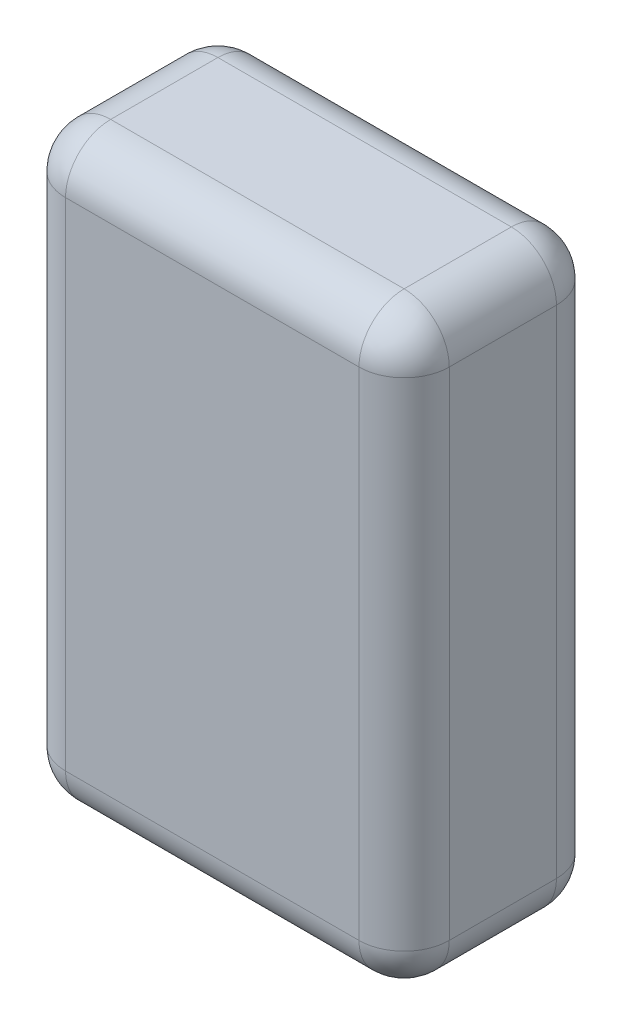
ISO-10303-21;
HEADER;
FILE_DESCRIPTION(('STEP AP214'),'2;1');
FILE_NAME('part.step','',(''),(''),'','','');
FILE_SCHEMA(('AUTOMOTIVE_DESIGN { 1 0 10303 214 1 1 1 1 }'));
ENDSEC;
DATA;
#1=APPLICATION_CONTEXT('core data for automotive mechanical design processes');
#2=APPLICATION_PROTOCOL_DEFINITION('international standard','automotive_design',2000,#1);
#3=PRODUCT_CONTEXT('',#1,'mechanical');
#4=PRODUCT('Part','Part','',(#3));
#5=PRODUCT_RELATED_PRODUCT_CATEGORY('part','',(#4));
#6=PRODUCT_DEFINITION_FORMATION('','',#4);
#7=PRODUCT_DEFINITION_CONTEXT('part definition',#1,'design');
#8=PRODUCT_DEFINITION('design','',#6,#7);
#9=PRODUCT_DEFINITION_SHAPE('','',#8);
#10=(LENGTH_UNIT() NAMED_UNIT(*) SI_UNIT(.MILLI.,.METRE.));
#11=(NAMED_UNIT(*) PLANE_ANGLE_UNIT() SI_UNIT($,.RADIAN.));
#12=(NAMED_UNIT(*) SI_UNIT($,.STERADIAN.) SOLID_ANGLE_UNIT());
#13=UNCERTAINTY_MEASURE_WITH_UNIT(LENGTH_MEASURE(1.E-05),#10,'distance_accuracy_value','');
#14=(GEOMETRIC_REPRESENTATION_CONTEXT(3) GLOBAL_UNCERTAINTY_ASSIGNED_CONTEXT((#13)) GLOBAL_UNIT_ASSIGNED_CONTEXT((#10,
#11,#12)) REPRESENTATION_CONTEXT('',''));
#15=CARTESIAN_POINT('',(0.,0.,0.));
#16=DIRECTION('',(0.,0.,1.));
#17=DIRECTION('',(1.,0.,0.));
#18=AXIS2_PLACEMENT_3D('',#15,#16,#17);
#19=CARTESIAN_POINT('',(8.5,-13.,8.75));
#20=DIRECTION('',(-1.,0.,0.));
#21=DIRECTION('',(0.,0.,1.));
#22=AXIS2_PLACEMENT_3D('',#19,#20,#21);
#23=PLANE('',#22);
#24=DIRECTION('',(0.,1.,0.));
#25=VECTOR('',#24,1.);
#26=CARTESIAN_POINT('',(8.5,-13.,6.75));
#27=LINE('',#26,#25);
#28=CARTESIAN_POINT('',(8.5,11.,6.75));
#29=VERTEX_POINT('',#28);
#30=CARTESIAN_POINT('',(8.5,-11.,6.75));
#31=VERTEX_POINT('',#30);
#32=EDGE_CURVE('E41',#29,#31,#27,.F.);
#33=ORIENTED_EDGE('',*,*,#32,.T.);
#34=DIRECTION('',(0.,0.,-1.));
#35=VECTOR('',#34,1.);
#36=CARTESIAN_POINT('',(8.5,-11.,8.75));
#37=LINE('',#36,#35);
#38=CARTESIAN_POINT('',(8.5,-11.,2.));
#39=VERTEX_POINT('',#38);
#40=EDGE_CURVE('E11',#31,#39,#37,.T.);
#41=ORIENTED_EDGE('',*,*,#40,.T.);
#42=DIRECTION('',(0.,1.,0.));
#43=VECTOR('',#42,1.);
#44=CARTESIAN_POINT('',(8.5,13.,2.));
#45=LINE('',#44,#43);
#46=CARTESIAN_POINT('',(8.5,11.,2.));
#47=VERTEX_POINT('',#46);
#48=EDGE_CURVE('E193',#39,#47,#45,.T.);
#49=ORIENTED_EDGE('',*,*,#48,.T.);
#50=DIRECTION('',(0.,0.,-1.));
#51=VECTOR('',#50,1.);
#52=CARTESIAN_POINT('',(8.5,11.,8.75));
#53=LINE('',#52,#51);
#54=EDGE_CURVE('E52',#47,#29,#53,.F.);
#55=ORIENTED_EDGE('',*,*,#54,.T.);
#56=EDGE_LOOP('',(#33,#41,#49,#55));
#57=FACE_BOUND('',#56,.T.);
#58=ADVANCED_FACE('F32',(#57),#23,.F.);
#59=CARTESIAN_POINT('',(-8.5,13.,8.75));
#60=DIRECTION('',(0.,-1.,0.));
#61=DIRECTION('',(0.,0.,-1.));
#62=AXIS2_PLACEMENT_3D('',#59,#60,#61);
#63=PLANE('',#62);
#64=DIRECTION('',(-1.,0.,0.));
#65=VECTOR('',#64,1.);
#66=CARTESIAN_POINT('',(-8.5,13.,2.));
#67=LINE('',#66,#65);
#68=CARTESIAN_POINT('',(6.5,13.,2.));
#69=VERTEX_POINT('',#68);
#70=CARTESIAN_POINT('',(-6.5,13.,2.));
#71=VERTEX_POINT('',#70);
#72=EDGE_CURVE('E161',#69,#71,#67,.T.);
#73=ORIENTED_EDGE('',*,*,#72,.T.);
#74=DIRECTION('',(0.,0.,-1.));
#75=VECTOR('',#74,1.);
#76=CARTESIAN_POINT('',(-6.5,13.,8.75));
#77=LINE('',#76,#75);
#78=CARTESIAN_POINT('',(-6.5,13.,6.75));
#79=VERTEX_POINT('',#78);
#80=EDGE_CURVE('E127',#71,#79,#77,.F.);
#81=ORIENTED_EDGE('',*,*,#80,.T.);
#82=DIRECTION('',(-1.,0.,0.));
#83=VECTOR('',#82,1.);
#84=CARTESIAN_POINT('',(-8.5,13.,6.75));
#85=LINE('',#84,#83);
#86=CARTESIAN_POINT('',(6.5,13.,6.75));
#87=VERTEX_POINT('',#86);
#88=EDGE_CURVE('E163',#79,#87,#85,.F.);
#89=ORIENTED_EDGE('',*,*,#88,.T.);
#90=DIRECTION('',(0.,0.,-1.));
#91=VECTOR('',#90,1.);
#92=CARTESIAN_POINT('',(6.5,13.,8.75));
#93=LINE('',#92,#91);
#94=EDGE_CURVE('E156',#87,#69,#93,.T.);
#95=ORIENTED_EDGE('',*,*,#94,.T.);
#96=EDGE_LOOP('',(#73,#81,#89,#95));
#97=FACE_BOUND('',#96,.T.);
#98=ADVANCED_FACE('F290',(#97),#63,.F.);
#99=CARTESIAN_POINT('',(-8.5,-13.,8.75));
#100=DIRECTION('',(1.,0.,0.));
#101=DIRECTION('',(0.,0.,-1.));
#102=AXIS2_PLACEMENT_3D('',#99,#100,#101);
#103=PLANE('',#102);
#104=DIRECTION('',(0.,0.,-1.));
#105=VECTOR('',#104,1.);
#106=CARTESIAN_POINT('',(-8.5,-11.,8.75));
#107=LINE('',#106,#105);
#108=CARTESIAN_POINT('',(-8.5,-11.,2.));
#109=VERTEX_POINT('',#108);
#110=CARTESIAN_POINT('',(-8.5,-11.,6.75));
#111=VERTEX_POINT('',#110);
#112=EDGE_CURVE('E149',#109,#111,#107,.F.);
#113=ORIENTED_EDGE('',*,*,#112,.T.);
#114=DIRECTION('',(0.,-1.,0.));
#115=VECTOR('',#114,1.);
#116=CARTESIAN_POINT('',(-8.5,-13.,6.75));
#117=LINE('',#116,#115);
#118=CARTESIAN_POINT('',(-8.5,11.,6.75));
#119=VERTEX_POINT('',#118);
#120=EDGE_CURVE('E153',#111,#119,#117,.F.);
#121=ORIENTED_EDGE('',*,*,#120,.T.);
#122=DIRECTION('',(0.,0.,-1.));
#123=VECTOR('',#122,1.);
#124=CARTESIAN_POINT('',(-8.5,11.,8.75));
#125=LINE('',#124,#123);
#126=CARTESIAN_POINT('',(-8.5,11.,2.));
#127=VERTEX_POINT('',#126);
#128=EDGE_CURVE('E125',#119,#127,#125,.T.);
#129=ORIENTED_EDGE('',*,*,#128,.T.);
#130=DIRECTION('',(0.,-1.,0.));
#131=VECTOR('',#130,1.);
#132=CARTESIAN_POINT('',(-8.5,-13.,2.));
#133=LINE('',#132,#131);
#134=EDGE_CURVE('E143',#127,#109,#133,.T.);
#135=ORIENTED_EDGE('',*,*,#134,.T.);
#136=EDGE_LOOP('',(#113,#121,#129,#135));
#137=FACE_BOUND('',#136,.T.);
#138=ADVANCED_FACE('F151',(#137),#103,.F.);
#139=CARTESIAN_POINT('',(-8.5,-13.,8.75));
#140=DIRECTION('',(0.,1.,0.));
#141=DIRECTION('',(0.,0.,1.));
#142=AXIS2_PLACEMENT_3D('',#139,#140,#141);
#143=PLANE('',#142);
#144=DIRECTION('',(1.,0.,0.));
#145=VECTOR('',#144,1.);
#146=CARTESIAN_POINT('',(-8.5,-13.,6.75));
#147=LINE('',#146,#145);
#148=CARTESIAN_POINT('',(6.5,-13.,6.75));
#149=VERTEX_POINT('',#148);
#150=CARTESIAN_POINT('',(-6.5,-13.,6.75));
#151=VERTEX_POINT('',#150);
#152=EDGE_CURVE('E170',#149,#151,#147,.F.);
#153=ORIENTED_EDGE('',*,*,#152,.T.);
#154=DIRECTION('',(0.,0.,-1.));
#155=VECTOR('',#154,1.);
#156=CARTESIAN_POINT('',(-6.5,-13.,8.75));
#157=LINE('',#156,#155);
#158=CARTESIAN_POINT('',(-6.5,-13.,2.));
#159=VERTEX_POINT('',#158);
#160=EDGE_CURVE('E172',#151,#159,#157,.T.);
#161=ORIENTED_EDGE('',*,*,#160,.T.);
#162=DIRECTION('',(1.,0.,0.));
#163=VECTOR('',#162,1.);
#164=CARTESIAN_POINT('',(8.5,-13.,2.));
#165=LINE('',#164,#163);
#166=CARTESIAN_POINT('',(6.5,-13.,2.));
#167=VERTEX_POINT('',#166);
#168=EDGE_CURVE('E168',#159,#167,#165,.T.);
#169=ORIENTED_EDGE('',*,*,#168,.T.);
#170=DIRECTION('',(0.,0.,-1.));
#171=VECTOR('',#170,1.);
#172=CARTESIAN_POINT('',(6.5,-13.,8.75));
#173=LINE('',#172,#171);
#174=EDGE_CURVE('E166',#167,#149,#173,.F.);
#175=ORIENTED_EDGE('',*,*,#174,.T.);
#176=EDGE_LOOP('',(#153,#161,#169,#175));
#177=FACE_BOUND('',#176,.T.);
#178=ADVANCED_FACE('F312',(#177),#143,.F.);
#179=CARTESIAN_POINT('',(0.,0.,8.75));
#180=DIRECTION('',(0.,0.,-1.));
#181=DIRECTION('',(-1.,0.,0.));
#182=AXIS2_PLACEMENT_3D('',#179,#180,#181);
#183=PLANE('',#182);
#184=DIRECTION('',(0.,-1.,0.));
#185=VECTOR('',#184,1.);
#186=CARTESIAN_POINT('',(-6.5,0.,8.75));
#187=LINE('',#186,#185);
#188=CARTESIAN_POINT('',(-6.5,11.,8.75));
#189=VERTEX_POINT('',#188);
#190=CARTESIAN_POINT('',(-6.5,-11.,8.75));
#191=VERTEX_POINT('',#190);
#192=EDGE_CURVE('E179',#189,#191,#187,.T.);
#193=ORIENTED_EDGE('',*,*,#192,.T.);
#194=DIRECTION('',(1.,0.,0.));
#195=VECTOR('',#194,1.);
#196=CARTESIAN_POINT('',(0.,-11.,8.75));
#197=LINE('',#196,#195);
#198=CARTESIAN_POINT('',(6.5,-11.,8.75));
#199=VERTEX_POINT('',#198);
#200=EDGE_CURVE('E181',#191,#199,#197,.T.);
#201=ORIENTED_EDGE('',*,*,#200,.T.);
#202=DIRECTION('',(0.,1.,0.));
#203=VECTOR('',#202,1.);
#204=CARTESIAN_POINT('',(6.5,0.,8.75));
#205=LINE('',#204,#203);
#206=CARTESIAN_POINT('',(6.5,11.,8.75));
#207=VERTEX_POINT('',#206);
#208=EDGE_CURVE('E175',#199,#207,#205,.T.);
#209=ORIENTED_EDGE('',*,*,#208,.T.);
#210=DIRECTION('',(-1.,0.,0.));
#211=VECTOR('',#210,1.);
#212=CARTESIAN_POINT('',(0.,11.,8.75));
#213=LINE('',#212,#211);
#214=EDGE_CURVE('E177',#207,#189,#213,.T.);
#215=ORIENTED_EDGE('',*,*,#214,.T.);
#216=EDGE_LOOP('',(#193,#201,#209,#215));
#217=FACE_BOUND('',#216,.T.);
#218=ADVANCED_FACE('F268',(#217),#183,.F.);
#219=CARTESIAN_POINT('',(0.,0.,0.));
#220=DIRECTION('',(0.,0.,-1.));
#221=DIRECTION('',(-1.,0.,0.));
#222=AXIS2_PLACEMENT_3D('',#219,#220,#221);
#223=PLANE('',#222);
#224=DIRECTION('',(0.,-1.,0.));
#225=VECTOR('',#224,1.);
#226=CARTESIAN_POINT('',(-6.5,13.,0.));
#227=LINE('',#226,#225);
#228=CARTESIAN_POINT('',(-6.5,-11.,0.));
#229=VERTEX_POINT('',#228);
#230=CARTESIAN_POINT('',(-6.5,11.,0.));
#231=VERTEX_POINT('',#230);
#232=EDGE_CURVE('E188',#229,#231,#227,.F.);
#233=ORIENTED_EDGE('',*,*,#232,.T.);
#234=DIRECTION('',(-1.,0.,0.));
#235=VECTOR('',#234,1.);
#236=CARTESIAN_POINT('',(8.5,11.,0.));
#237=LINE('',#236,#235);
#238=CARTESIAN_POINT('',(6.5,11.,0.));
#239=VERTEX_POINT('',#238);
#240=EDGE_CURVE('E190',#231,#239,#237,.F.);
#241=ORIENTED_EDGE('',*,*,#240,.T.);
#242=DIRECTION('',(0.,1.,0.));
#243=VECTOR('',#242,1.);
#244=CARTESIAN_POINT('',(6.5,-13.,0.));
#245=LINE('',#244,#243);
#246=CARTESIAN_POINT('',(6.5,-11.,0.));
#247=VERTEX_POINT('',#246);
#248=EDGE_CURVE('E184',#239,#247,#245,.F.);
#249=ORIENTED_EDGE('',*,*,#248,.T.);
#250=DIRECTION('',(1.,0.,0.));
#251=VECTOR('',#250,1.);
#252=CARTESIAN_POINT('',(-8.5,-11.,0.));
#253=LINE('',#252,#251);
#254=EDGE_CURVE('E186',#247,#229,#253,.F.);
#255=ORIENTED_EDGE('',*,*,#254,.T.);
#256=EDGE_LOOP('',(#233,#241,#249,#255));
#257=FACE_BOUND('',#256,.T.);
#258=ADVANCED_FACE('F298',(#257),#223,.T.);
#259=CARTESIAN_POINT('',(6.5,-11.,8.75));
#260=DIRECTION('',(0.,0.,-1.));
#261=DIRECTION('',(-1.,0.,0.));
#262=AXIS2_PLACEMENT_3D('',#259,#260,#261);
#263=CYLINDRICAL_SURFACE('',#262,2.);
#264=CARTESIAN_POINT('',(6.5,-11.,6.75));
#265=DIRECTION('',(0.,0.,1.));
#266=DIRECTION('',(1.,0.,0.));
#267=AXIS2_PLACEMENT_3D('',#264,#265,#266);
#268=CIRCLE('',#267,2.);
#269=EDGE_CURVE('E36',#149,#31,#268,.T.);
#270=ORIENTED_EDGE('',*,*,#269,.F.);
#271=ORIENTED_EDGE('',*,*,#174,.F.);
#272=CARTESIAN_POINT('',(6.5,-11.,2.));
#273=DIRECTION('',(0.,0.,-1.));
#274=DIRECTION('',(-1.,0.,0.));
#275=AXIS2_PLACEMENT_3D('',#272,#273,#274);
#276=CIRCLE('',#275,2.);
#277=EDGE_CURVE('E247',#39,#167,#276,.T.);
#278=ORIENTED_EDGE('',*,*,#277,.F.);
#279=ORIENTED_EDGE('',*,*,#40,.F.);
#280=EDGE_LOOP('',(#270,#271,#278,#279));
#281=FACE_BOUND('',#280,.T.);
#282=ADVANCED_FACE('F34',(#281),#263,.T.);
#283=CARTESIAN_POINT('',(6.5,-11.,6.75));
#284=DIRECTION('',(0.,0.,1.));
#285=DIRECTION('',(1.,0.,0.));
#286=AXIS2_PLACEMENT_3D('',#283,#284,#285);
#287=SPHERICAL_SURFACE('',#286,2.);
#288=CARTESIAN_POINT('',(6.5,-11.,6.75));
#289=DIRECTION('',(1.,0.,0.));
#290=DIRECTION('',(0.,0.,-1.));
#291=AXIS2_PLACEMENT_3D('',#288,#289,#290);
#292=CIRCLE('',#291,2.);
#293=EDGE_CURVE('E242',#149,#199,#292,.F.);
#294=ORIENTED_EDGE('',*,*,#293,.F.);
#295=ORIENTED_EDGE('',*,*,#269,.T.);
#296=CARTESIAN_POINT('',(6.5,-11.,6.75));
#297=DIRECTION('',(0.,-1.,0.));
#298=DIRECTION('',(0.,0.,-1.));
#299=AXIS2_PLACEMENT_3D('',#296,#297,#298);
#300=CIRCLE('',#299,2.);
#301=EDGE_CURVE('E245',#199,#31,#300,.F.);
#302=ORIENTED_EDGE('',*,*,#301,.F.);
#303=EDGE_LOOP('',(#294,#295,#302));
#304=FACE_BOUND('',#303,.T.);
#305=ADVANCED_FACE('F258',(#304),#287,.T.);
#306=CARTESIAN_POINT('',(6.5,-11.,2.));
#307=DIRECTION('',(0.,0.,1.));
#308=DIRECTION('',(1.,0.,0.));
#309=AXIS2_PLACEMENT_3D('',#306,#307,#308);
#310=SPHERICAL_SURFACE('',#309,2.);
#311=CARTESIAN_POINT('',(6.5,-11.,2.));
#312=DIRECTION('',(0.,-1.,0.));
#313=DIRECTION('',(0.,0.,-1.));
#314=AXIS2_PLACEMENT_3D('',#311,#312,#313);
#315=CIRCLE('',#314,2.);
#316=EDGE_CURVE('E236',#39,#247,#315,.F.);
#317=ORIENTED_EDGE('',*,*,#316,.F.);
#318=ORIENTED_EDGE('',*,*,#277,.T.);
#319=CARTESIAN_POINT('',(6.5,-11.,2.));
#320=DIRECTION('',(1.,0.,0.));
#321=DIRECTION('',(0.,0.,-1.));
#322=AXIS2_PLACEMENT_3D('',#319,#320,#321);
#323=CIRCLE('',#322,2.);
#324=EDGE_CURVE('E239',#247,#167,#323,.F.);
#325=ORIENTED_EDGE('',*,*,#324,.F.);
#326=EDGE_LOOP('',(#317,#318,#325));
#327=FACE_BOUND('',#326,.T.);
#328=ADVANCED_FACE('F455',(#327),#310,.T.);
#329=CARTESIAN_POINT('',(6.5,0.,6.75));
#330=DIRECTION('',(0.,1.,0.));
#331=DIRECTION('',(0.,0.,1.));
#332=AXIS2_PLACEMENT_3D('',#329,#330,#331);
#333=CYLINDRICAL_SURFACE('',#332,2.);
#334=ORIENTED_EDGE('',*,*,#301,.T.);
#335=ORIENTED_EDGE('',*,*,#32,.F.);
#336=CARTESIAN_POINT('',(6.5,11.,6.75));
#337=DIRECTION('',(0.,1.,0.));
#338=DIRECTION('',(0.,0.,1.));
#339=AXIS2_PLACEMENT_3D('',#336,#337,#338);
#340=CIRCLE('',#339,2.);
#341=EDGE_CURVE('E230',#207,#29,#340,.T.);
#342=ORIENTED_EDGE('',*,*,#341,.F.);
#343=ORIENTED_EDGE('',*,*,#208,.F.);
#344=EDGE_LOOP('',(#334,#335,#342,#343));
#345=FACE_BOUND('',#344,.T.);
#346=ADVANCED_FACE('F263',(#345),#333,.T.);
#347=CARTESIAN_POINT('',(0.,-11.,6.75));
#348=DIRECTION('',(1.,0.,0.));
#349=DIRECTION('',(0.,0.,-1.));
#350=AXIS2_PLACEMENT_3D('',#347,#348,#349);
#351=CYLINDRICAL_SURFACE('',#350,2.);
#352=ORIENTED_EDGE('',*,*,#293,.T.);
#353=ORIENTED_EDGE('',*,*,#200,.F.);
#354=CARTESIAN_POINT('',(-6.5,-11.,6.75));
#355=DIRECTION('',(-1.,0.,0.));
#356=DIRECTION('',(0.,0.,1.));
#357=AXIS2_PLACEMENT_3D('',#354,#355,#356);
#358=CIRCLE('',#357,2.);
#359=EDGE_CURVE('E227',#151,#191,#358,.T.);
#360=ORIENTED_EDGE('',*,*,#359,.F.);
#361=ORIENTED_EDGE('',*,*,#152,.F.);
#362=EDGE_LOOP('',(#352,#353,#360,#361));
#363=FACE_BOUND('',#362,.T.);
#364=ADVANCED_FACE('F274',(#363),#351,.T.);
#365=CARTESIAN_POINT('',(-6.5,-11.,8.75));
#366=DIRECTION('',(0.,0.,-1.));
#367=DIRECTION('',(-1.,0.,0.));
#368=AXIS2_PLACEMENT_3D('',#365,#366,#367);
#369=CYLINDRICAL_SURFACE('',#368,2.);
#370=CARTESIAN_POINT('',(-6.5,-11.,2.));
#371=DIRECTION('',(0.,0.,-1.));
#372=DIRECTION('',(-1.,0.,0.));
#373=AXIS2_PLACEMENT_3D('',#370,#371,#372);
#374=CIRCLE('',#373,2.);
#375=EDGE_CURVE('E221',#159,#109,#374,.T.);
#376=ORIENTED_EDGE('',*,*,#375,.F.);
#377=ORIENTED_EDGE('',*,*,#160,.F.);
#378=CARTESIAN_POINT('',(-6.5,-11.,6.75));
#379=DIRECTION('',(0.,0.,1.));
#380=DIRECTION('',(1.,0.,0.));
#381=AXIS2_PLACEMENT_3D('',#378,#379,#380);
#382=CIRCLE('',#381,2.);
#383=EDGE_CURVE('E224',#111,#151,#382,.T.);
#384=ORIENTED_EDGE('',*,*,#383,.F.);
#385=ORIENTED_EDGE('',*,*,#112,.F.);
#386=EDGE_LOOP('',(#376,#377,#384,#385));
#387=FACE_BOUND('',#386,.T.);
#388=ADVANCED_FACE('F310',(#387),#369,.T.);
#389=CARTESIAN_POINT('',(-8.5,-11.,2.));
#390=DIRECTION('',(-1.,0.,0.));
#391=DIRECTION('',(0.,0.,1.));
#392=AXIS2_PLACEMENT_3D('',#389,#390,#391);
#393=CYLINDRICAL_SURFACE('',#392,2.);
#394=ORIENTED_EDGE('',*,*,#324,.T.);
#395=ORIENTED_EDGE('',*,*,#168,.F.);
#396=CARTESIAN_POINT('',(-6.5,-11.,2.));
#397=DIRECTION('',(-1.,0.,0.));
#398=DIRECTION('',(0.,0.,1.));
#399=AXIS2_PLACEMENT_3D('',#396,#397,#398);
#400=CIRCLE('',#399,2.);
#401=EDGE_CURVE('E219',#229,#159,#400,.T.);
#402=ORIENTED_EDGE('',*,*,#401,.F.);
#403=ORIENTED_EDGE('',*,*,#254,.F.);
#404=EDGE_LOOP('',(#394,#395,#402,#403));
#405=FACE_BOUND('',#404,.T.);
#406=ADVANCED_FACE('F304',(#405),#393,.T.);
#407=CARTESIAN_POINT('',(6.5,-13.,2.));
#408=DIRECTION('',(0.,-1.,0.));
#409=DIRECTION('',(0.,0.,-1.));
#410=AXIS2_PLACEMENT_3D('',#407,#408,#409);
#411=CYLINDRICAL_SURFACE('',#410,2.);
#412=ORIENTED_EDGE('',*,*,#316,.T.);
#413=ORIENTED_EDGE('',*,*,#248,.F.);
#414=CARTESIAN_POINT('',(6.5,11.,2.));
#415=DIRECTION('',(0.,1.,0.));
#416=DIRECTION('',(0.,0.,1.));
#417=AXIS2_PLACEMENT_3D('',#414,#415,#416);
#418=CIRCLE('',#417,2.);
#419=EDGE_CURVE('E216',#47,#239,#418,.T.);
#420=ORIENTED_EDGE('',*,*,#419,.F.);
#421=ORIENTED_EDGE('',*,*,#48,.F.);
#422=EDGE_LOOP('',(#412,#413,#420,#421));
#423=FACE_BOUND('',#422,.T.);
#424=ADVANCED_FACE('F317',(#423),#411,.T.);
#425=CARTESIAN_POINT('',(6.5,11.,8.75));
#426=DIRECTION('',(0.,0.,-1.));
#427=DIRECTION('',(-1.,0.,0.));
#428=AXIS2_PLACEMENT_3D('',#425,#426,#427);
#429=CYLINDRICAL_SURFACE('',#428,2.);
#430=CARTESIAN_POINT('',(6.5,11.,6.75));
#431=DIRECTION('',(0.,0.,1.));
#432=DIRECTION('',(1.,0.,0.));
#433=AXIS2_PLACEMENT_3D('',#430,#431,#432);
#434=CIRCLE('',#433,2.);
#435=EDGE_CURVE('E233',#29,#87,#434,.T.);
#436=ORIENTED_EDGE('',*,*,#435,.F.);
#437=ORIENTED_EDGE('',*,*,#54,.F.);
#438=CARTESIAN_POINT('',(6.5,11.,2.));
#439=DIRECTION('',(0.,0.,-1.));
#440=DIRECTION('',(-1.,0.,0.));
#441=AXIS2_PLACEMENT_3D('',#438,#439,#440);
#442=CIRCLE('',#441,2.);
#443=EDGE_CURVE('E213',#69,#47,#442,.T.);
#444=ORIENTED_EDGE('',*,*,#443,.F.);
#445=ORIENTED_EDGE('',*,*,#94,.F.);
#446=EDGE_LOOP('',(#436,#437,#444,#445));
#447=FACE_BOUND('',#446,.T.);
#448=ADVANCED_FACE('F316',(#447),#429,.T.);
#449=CARTESIAN_POINT('',(6.5,11.,6.75));
#450=DIRECTION('',(0.,0.,1.));
#451=DIRECTION('',(1.,0.,0.));
#452=AXIS2_PLACEMENT_3D('',#449,#450,#451);
#453=SPHERICAL_SURFACE('',#452,2.);
#454=ORIENTED_EDGE('',*,*,#341,.T.);
#455=ORIENTED_EDGE('',*,*,#435,.T.);
#456=CARTESIAN_POINT('',(6.5,11.,6.75));
#457=DIRECTION('',(1.,0.,0.));
#458=DIRECTION('',(0.,0.,-1.));
#459=AXIS2_PLACEMENT_3D('',#456,#457,#458);
#460=CIRCLE('',#459,2.);
#461=EDGE_CURVE('E210',#207,#87,#460,.F.);
#462=ORIENTED_EDGE('',*,*,#461,.F.);
#463=EDGE_LOOP('',(#454,#455,#462));
#464=FACE_BOUND('',#463,.T.);
#465=ADVANCED_FACE('F404',(#464),#453,.T.);
#466=CARTESIAN_POINT('',(-6.5,-11.,6.75));
#467=DIRECTION('',(0.,0.,1.));
#468=DIRECTION('',(1.,0.,0.));
#469=AXIS2_PLACEMENT_3D('',#466,#467,#468);
#470=SPHERICAL_SURFACE('',#469,2.);
#471=ORIENTED_EDGE('',*,*,#383,.T.);
#472=ORIENTED_EDGE('',*,*,#359,.T.);
#473=CARTESIAN_POINT('',(-6.5,-11.,6.75));
#474=DIRECTION('',(0.,-1.,0.));
#475=DIRECTION('',(0.,0.,-1.));
#476=AXIS2_PLACEMENT_3D('',#473,#474,#475);
#477=CIRCLE('',#476,2.);
#478=EDGE_CURVE('E207',#111,#191,#477,.F.);
#479=ORIENTED_EDGE('',*,*,#478,.F.);
#480=EDGE_LOOP('',(#471,#472,#479));
#481=FACE_BOUND('',#480,.T.);
#482=ADVANCED_FACE('F277',(#481),#470,.T.);
#483=CARTESIAN_POINT('',(-6.5,-11.,2.));
#484=DIRECTION('',(0.,0.,1.));
#485=DIRECTION('',(1.,0.,0.));
#486=AXIS2_PLACEMENT_3D('',#483,#484,#485);
#487=SPHERICAL_SURFACE('',#486,2.);
#488=ORIENTED_EDGE('',*,*,#401,.T.);
#489=ORIENTED_EDGE('',*,*,#375,.T.);
#490=CARTESIAN_POINT('',(-6.5,-11.,2.));
#491=DIRECTION('',(0.,-1.,0.));
#492=DIRECTION('',(0.,0.,-1.));
#493=AXIS2_PLACEMENT_3D('',#490,#491,#492);
#494=CIRCLE('',#493,2.);
#495=EDGE_CURVE('E146',#229,#109,#494,.F.);
#496=ORIENTED_EDGE('',*,*,#495,.F.);
#497=EDGE_LOOP('',(#488,#489,#496));
#498=FACE_BOUND('',#497,.T.);
#499=ADVANCED_FACE('F307',(#498),#487,.T.);
#500=CARTESIAN_POINT('',(6.5,11.,2.));
#501=DIRECTION('',(0.,0.,1.));
#502=DIRECTION('',(1.,0.,0.));
#503=AXIS2_PLACEMENT_3D('',#500,#501,#502);
#504=SPHERICAL_SURFACE('',#503,2.);
#505=ORIENTED_EDGE('',*,*,#443,.T.);
#506=ORIENTED_EDGE('',*,*,#419,.T.);
#507=CARTESIAN_POINT('',(6.5,11.,2.));
#508=DIRECTION('',(1.,0.,0.));
#509=DIRECTION('',(0.,0.,-1.));
#510=AXIS2_PLACEMENT_3D('',#507,#508,#509);
#511=CIRCLE('',#510,2.);
#512=EDGE_CURVE('E204',#69,#239,#511,.F.);
#513=ORIENTED_EDGE('',*,*,#512,.F.);
#514=EDGE_LOOP('',(#505,#506,#513));
#515=FACE_BOUND('',#514,.T.);
#516=ADVANCED_FACE('F319',(#515),#504,.T.);
#517=CARTESIAN_POINT('',(0.,11.,6.75));
#518=DIRECTION('',(-1.,0.,0.));
#519=DIRECTION('',(0.,0.,1.));
#520=AXIS2_PLACEMENT_3D('',#517,#518,#519);
#521=CYLINDRICAL_SURFACE('',#520,2.);
#522=ORIENTED_EDGE('',*,*,#461,.T.);
#523=ORIENTED_EDGE('',*,*,#88,.F.);
#524=CARTESIAN_POINT('',(-6.5,11.,6.75));
#525=DIRECTION('',(-1.,0.,0.));
#526=DIRECTION('',(0.,0.,1.));
#527=AXIS2_PLACEMENT_3D('',#524,#525,#526);
#528=CIRCLE('',#527,2.);
#529=EDGE_CURVE('E201',#189,#79,#528,.T.);
#530=ORIENTED_EDGE('',*,*,#529,.F.);
#531=ORIENTED_EDGE('',*,*,#214,.F.);
#532=EDGE_LOOP('',(#522,#523,#530,#531));
#533=FACE_BOUND('',#532,.T.);
#534=ADVANCED_FACE('F287',(#533),#521,.T.);
#535=CARTESIAN_POINT('',(-6.5,0.,6.75));
#536=DIRECTION('',(0.,-1.,0.));
#537=DIRECTION('',(0.,0.,-1.));
#538=AXIS2_PLACEMENT_3D('',#535,#536,#537);
#539=CYLINDRICAL_SURFACE('',#538,2.);
#540=ORIENTED_EDGE('',*,*,#478,.T.);
#541=ORIENTED_EDGE('',*,*,#192,.F.);
#542=CARTESIAN_POINT('',(-6.5,11.,6.75));
#543=DIRECTION('',(0.,1.,0.));
#544=DIRECTION('',(0.,0.,1.));
#545=AXIS2_PLACEMENT_3D('',#542,#543,#544);
#546=CIRCLE('',#545,2.);
#547=EDGE_CURVE('E140',#119,#189,#546,.T.);
#548=ORIENTED_EDGE('',*,*,#547,.F.);
#549=ORIENTED_EDGE('',*,*,#120,.F.);
#550=EDGE_LOOP('',(#540,#541,#548,#549));
#551=FACE_BOUND('',#550,.T.);
#552=ADVANCED_FACE('F280',(#551),#539,.T.);
#553=CARTESIAN_POINT('',(-6.5,-13.,2.));
#554=DIRECTION('',(0.,1.,0.));
#555=DIRECTION('',(0.,0.,1.));
#556=AXIS2_PLACEMENT_3D('',#553,#554,#555);
#557=CYLINDRICAL_SURFACE('',#556,2.);
#558=ORIENTED_EDGE('',*,*,#495,.T.);
#559=ORIENTED_EDGE('',*,*,#134,.F.);
#560=CARTESIAN_POINT('',(-6.5,11.,2.));
#561=DIRECTION('',(0.,1.,0.));
#562=DIRECTION('',(-1.,0.,0.));
#563=AXIS2_PLACEMENT_3D('',#560,#561,#562);
#564=CIRCLE('',#563,2.);
#565=EDGE_CURVE('E133',#231,#127,#564,.T.);
#566=ORIENTED_EDGE('',*,*,#565,.F.);
#567=ORIENTED_EDGE('',*,*,#232,.F.);
#568=EDGE_LOOP('',(#558,#559,#566,#567));
#569=FACE_BOUND('',#568,.T.);
#570=ADVANCED_FACE('F144',(#569),#557,.T.);
#571=CARTESIAN_POINT('',(-8.5,11.,2.));
#572=DIRECTION('',(1.,0.,0.));
#573=DIRECTION('',(0.,0.,-1.));
#574=AXIS2_PLACEMENT_3D('',#571,#572,#573);
#575=CYLINDRICAL_SURFACE('',#574,2.);
#576=ORIENTED_EDGE('',*,*,#512,.T.);
#577=ORIENTED_EDGE('',*,*,#240,.F.);
#578=CARTESIAN_POINT('',(-6.5,11.,2.));
#579=DIRECTION('',(-1.,0.,0.));
#580=DIRECTION('',(0.,0.,1.));
#581=AXIS2_PLACEMENT_3D('',#578,#579,#580);
#582=CIRCLE('',#581,2.);
#583=EDGE_CURVE('E137',#71,#231,#582,.T.);
#584=ORIENTED_EDGE('',*,*,#583,.F.);
#585=ORIENTED_EDGE('',*,*,#72,.F.);
#586=EDGE_LOOP('',(#576,#577,#584,#585));
#587=FACE_BOUND('',#586,.T.);
#588=ADVANCED_FACE('F295',(#587),#575,.T.);
#589=CARTESIAN_POINT('',(-6.5,11.,6.75));
#590=DIRECTION('',(0.,0.,1.));
#591=DIRECTION('',(1.,0.,0.));
#592=AXIS2_PLACEMENT_3D('',#589,#590,#591);
#593=SPHERICAL_SURFACE('',#592,2.);
#594=ORIENTED_EDGE('',*,*,#547,.T.);
#595=ORIENTED_EDGE('',*,*,#529,.T.);
#596=CARTESIAN_POINT('',(-6.5,11.,6.75));
#597=DIRECTION('',(0.,0.,1.));
#598=DIRECTION('',(1.,0.,0.));
#599=AXIS2_PLACEMENT_3D('',#596,#597,#598);
#600=CIRCLE('',#599,2.);
#601=EDGE_CURVE('E130',#119,#79,#600,.F.);
#602=ORIENTED_EDGE('',*,*,#601,.F.);
#603=EDGE_LOOP('',(#594,#595,#602));
#604=FACE_BOUND('',#603,.T.);
#605=ADVANCED_FACE('F284',(#604),#593,.T.);
#606=CARTESIAN_POINT('',(-6.5,11.,2.));
#607=DIRECTION('',(0.,0.,1.));
#608=DIRECTION('',(1.,0.,0.));
#609=AXIS2_PLACEMENT_3D('',#606,#607,#608);
#610=SPHERICAL_SURFACE('',#609,2.);
#611=ORIENTED_EDGE('',*,*,#583,.T.);
#612=ORIENTED_EDGE('',*,*,#565,.T.);
#613=CARTESIAN_POINT('',(-6.5,11.,2.));
#614=DIRECTION('',(0.,0.,-1.));
#615=DIRECTION('',(-1.,0.,0.));
#616=AXIS2_PLACEMENT_3D('',#613,#614,#615);
#617=CIRCLE('',#616,2.);
#618=EDGE_CURVE('E121',#71,#127,#617,.F.);
#619=ORIENTED_EDGE('',*,*,#618,.F.);
#620=EDGE_LOOP('',(#611,#612,#619));
#621=FACE_BOUND('',#620,.T.);
#622=ADVANCED_FACE('F135',(#621),#610,.T.);
#623=CARTESIAN_POINT('',(-6.5,11.,8.75));
#624=DIRECTION('',(0.,0.,-1.));
#625=DIRECTION('',(-1.,0.,0.));
#626=AXIS2_PLACEMENT_3D('',#623,#624,#625);
#627=CYLINDRICAL_SURFACE('',#626,2.);
#628=ORIENTED_EDGE('',*,*,#601,.T.);
#629=ORIENTED_EDGE('',*,*,#80,.F.);
#630=ORIENTED_EDGE('',*,*,#618,.T.);
#631=ORIENTED_EDGE('',*,*,#128,.F.);
#632=EDGE_LOOP('',(#628,#629,#630,#631));
#633=FACE_BOUND('',#632,.T.);
#634=ADVANCED_FACE('F123',(#633),#627,.T.);
#635=CLOSED_SHELL('',(#58,#98,#138,#178,#218,#258,#282,#305,#328,#346,#364,#388,#406,#424,#448,
#465,#482,#499,#516,#534,#552,#570,#588,#605,#622,#634));
#636=MANIFOLD_SOLID_BREP('B2',#635);
#637=ADVANCED_BREP_SHAPE_REPRESENTATION('',(#18,#636),#14);
#638=SHAPE_DEFINITION_REPRESENTATION(#9,#637);
ENDSEC;
END-ISO-10303-21;
